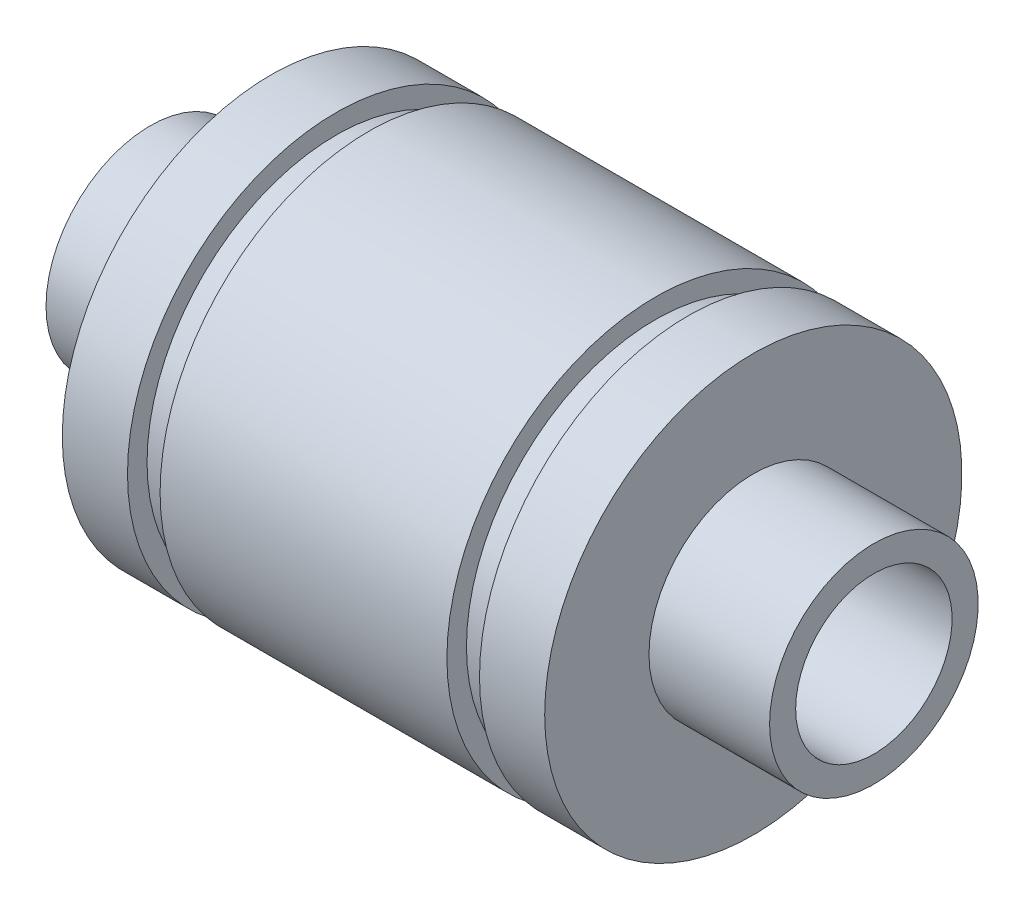
ISO-10303-21;
HEADER;
FILE_DESCRIPTION(('STEP AP214'),'2;1');
FILE_NAME('part.step','',(''),(''),'','','');
FILE_SCHEMA(('AUTOMOTIVE_DESIGN { 1 0 10303 214 1 1 1 1 }'));
ENDSEC;
DATA;
#1=APPLICATION_CONTEXT('core data for automotive mechanical design processes');
#2=APPLICATION_PROTOCOL_DEFINITION('international standard','automotive_design',2000,#1);
#3=PRODUCT_CONTEXT('',#1,'mechanical');
#4=PRODUCT('Part','Part','',(#3));
#5=PRODUCT_RELATED_PRODUCT_CATEGORY('part','',(#4));
#6=PRODUCT_DEFINITION_FORMATION('','',#4);
#7=PRODUCT_DEFINITION_CONTEXT('part definition',#1,'design');
#8=PRODUCT_DEFINITION('design','',#6,#7);
#9=PRODUCT_DEFINITION_SHAPE('','',#8);
#10=(LENGTH_UNIT() NAMED_UNIT(*) SI_UNIT(.MILLI.,.METRE.));
#11=(NAMED_UNIT(*) PLANE_ANGLE_UNIT() SI_UNIT($,.RADIAN.));
#12=(NAMED_UNIT(*) SI_UNIT($,.STERADIAN.) SOLID_ANGLE_UNIT());
#13=UNCERTAINTY_MEASURE_WITH_UNIT(LENGTH_MEASURE(1.E-05),#10,'distance_accuracy_value','');
#14=(GEOMETRIC_REPRESENTATION_CONTEXT(3) GLOBAL_UNCERTAINTY_ASSIGNED_CONTEXT((#13)) GLOBAL_UNIT_ASSIGNED_CONTEXT((#10,
#11,#12)) REPRESENTATION_CONTEXT('',''));
#15=CARTESIAN_POINT('',(0.,0.,0.));
#16=DIRECTION('',(0.,0.,1.));
#17=DIRECTION('',(1.,0.,0.));
#18=AXIS2_PLACEMENT_3D('',#15,#16,#17);
#19=CARTESIAN_POINT('',(27.75,8.,0.));
#20=DIRECTION('',(-1.,0.,0.));
#21=DIRECTION('',(0.,0.,1.));
#22=AXIS2_PLACEMENT_3D('',#19,#20,#21);
#23=PLANE('',#22);
#24=CARTESIAN_POINT('',(27.75,0.,0.));
#25=DIRECTION('',(-1.,0.,0.));
#26=DIRECTION('',(0.,0.,1.));
#27=AXIS2_PLACEMENT_3D('',#24,#25,#26);
#28=CIRCLE('',#27,6.);
#29=CARTESIAN_POINT('',(27.75,0.,6.));
#30=VERTEX_POINT('',#29);
#31=EDGE_CURVE('E80',#30,#30,#28,.T.);
#32=ORIENTED_EDGE('',*,*,#31,.T.);
#33=EDGE_LOOP('',(#32));
#34=FACE_BOUND('',#33,.T.);
#35=CARTESIAN_POINT('',(27.75,0.,0.));
#36=DIRECTION('',(-1.,0.,0.));
#37=DIRECTION('',(0.,0.,1.));
#38=AXIS2_PLACEMENT_3D('',#35,#36,#37);
#39=CIRCLE('',#38,8.);
#40=CARTESIAN_POINT('',(27.75,0.,8.));
#41=VERTEX_POINT('',#40);
#42=EDGE_CURVE('E77',#41,#41,#39,.T.);
#43=ORIENTED_EDGE('',*,*,#42,.F.);
#44=EDGE_LOOP('',(#43));
#45=FACE_BOUND('',#44,.T.);
#46=ADVANCED_FACE('F31',(#34,#45),#23,.F.);
#47=CARTESIAN_POINT('',(-27.75,7.99999999999999,0.));
#48=DIRECTION('',(1.,0.,0.));
#49=DIRECTION('',(0.,0.,-1.));
#50=AXIS2_PLACEMENT_3D('',#47,#48,#49);
#51=PLANE('',#50);
#52=CARTESIAN_POINT('',(-27.75,0.,0.));
#53=DIRECTION('',(-1.,0.,0.));
#54=DIRECTION('',(0.,0.,1.));
#55=AXIS2_PLACEMENT_3D('',#52,#53,#54);
#56=CIRCLE('',#55,6.);
#57=CARTESIAN_POINT('',(-27.75,0.,6.));
#58=VERTEX_POINT('',#57);
#59=EDGE_CURVE('E81',#58,#58,#56,.T.);
#60=ORIENTED_EDGE('',*,*,#59,.F.);
#61=EDGE_LOOP('',(#60));
#62=FACE_BOUND('',#61,.T.);
#63=CARTESIAN_POINT('',(-27.75,0.,0.));
#64=DIRECTION('',(-1.,0.,0.));
#65=DIRECTION('',(0.,0.,1.));
#66=AXIS2_PLACEMENT_3D('',#63,#64,#65);
#67=CIRCLE('',#66,7.99999999999999);
#68=CARTESIAN_POINT('',(-27.75,0.,7.99999999999999));
#69=VERTEX_POINT('',#68);
#70=EDGE_CURVE('E10',#69,#69,#67,.T.);
#71=ORIENTED_EDGE('',*,*,#70,.T.);
#72=EDGE_LOOP('',(#71));
#73=FACE_BOUND('',#72,.T.);
#74=ADVANCED_FACE('F96',(#62,#73),#51,.F.);
#75=CARTESIAN_POINT('',(-12.75,0.,0.));
#76=DIRECTION('',(-1.,0.,0.));
#77=DIRECTION('',(0.,0.,1.));
#78=AXIS2_PLACEMENT_3D('',#75,#76,#77);
#79=CYLINDRICAL_SURFACE('',#78,7.99999999999999);
#80=ORIENTED_EDGE('',*,*,#70,.F.);
#81=EDGE_LOOP('',(#80));
#82=FACE_BOUND('',#81,.T.);
#83=CARTESIAN_POINT('',(-18.5,0.,0.));
#84=DIRECTION('',(-1.,0.,0.));
#85=DIRECTION('',(0.,0.,1.));
#86=AXIS2_PLACEMENT_3D('',#83,#84,#85);
#87=CIRCLE('',#86,7.99999999999999);
#88=CARTESIAN_POINT('',(-18.5,0.,7.99999999999999));
#89=VERTEX_POINT('',#88);
#90=EDGE_CURVE('E37',#89,#89,#87,.T.);
#91=ORIENTED_EDGE('',*,*,#90,.T.);
#92=EDGE_LOOP('',(#91));
#93=FACE_BOUND('',#92,.T.);
#94=ADVANCED_FACE('F98',(#82,#93),#79,.T.);
#95=CARTESIAN_POINT('',(-18.5,16.,0.));
#96=DIRECTION('',(1.,0.,0.));
#97=DIRECTION('',(0.,0.,-1.));
#98=AXIS2_PLACEMENT_3D('',#95,#96,#97);
#99=PLANE('',#98);
#100=ORIENTED_EDGE('',*,*,#90,.F.);
#101=EDGE_LOOP('',(#100));
#102=FACE_BOUND('',#101,.T.);
#103=CARTESIAN_POINT('',(-18.5,0.,0.));
#104=DIRECTION('',(-1.,0.,0.));
#105=DIRECTION('',(0.,0.,1.));
#106=AXIS2_PLACEMENT_3D('',#103,#104,#105);
#107=CIRCLE('',#106,16.);
#108=CARTESIAN_POINT('',(-18.5,0.,16.));
#109=VERTEX_POINT('',#108);
#110=EDGE_CURVE('E41',#109,#109,#107,.T.);
#111=ORIENTED_EDGE('',*,*,#110,.T.);
#112=EDGE_LOOP('',(#111));
#113=FACE_BOUND('',#112,.T.);
#114=ADVANCED_FACE('F103',(#102,#113),#99,.F.);
#115=CARTESIAN_POINT('',(-12.75,0.,0.));
#116=DIRECTION('',(-1.,0.,0.));
#117=DIRECTION('',(0.,0.,1.));
#118=AXIS2_PLACEMENT_3D('',#115,#116,#117);
#119=CYLINDRICAL_SURFACE('',#118,16.);
#120=ORIENTED_EDGE('',*,*,#110,.F.);
#121=EDGE_LOOP('',(#120));
#122=FACE_BOUND('',#121,.T.);
#123=CARTESIAN_POINT('',(-13.5,0.,0.));
#124=DIRECTION('',(-1.,0.,0.));
#125=DIRECTION('',(0.,0.,1.));
#126=AXIS2_PLACEMENT_3D('',#123,#124,#125);
#127=CIRCLE('',#126,16.);
#128=CARTESIAN_POINT('',(-13.5,0.,16.));
#129=VERTEX_POINT('',#128);
#130=EDGE_CURVE('E45',#129,#129,#127,.T.);
#131=ORIENTED_EDGE('',*,*,#130,.T.);
#132=EDGE_LOOP('',(#131));
#133=FACE_BOUND('',#132,.T.);
#134=ADVANCED_FACE('F109',(#122,#133),#119,.T.);
#135=CARTESIAN_POINT('',(-13.5,16.,0.));
#136=DIRECTION('',(-1.,0.,0.));
#137=DIRECTION('',(0.,0.,1.));
#138=AXIS2_PLACEMENT_3D('',#135,#136,#137);
#139=PLANE('',#138);
#140=ORIENTED_EDGE('',*,*,#130,.F.);
#141=EDGE_LOOP('',(#140));
#142=FACE_BOUND('',#141,.T.);
#143=CARTESIAN_POINT('',(-13.5,0.,0.));
#144=DIRECTION('',(-1.,0.,0.));
#145=DIRECTION('',(0.,0.,1.));
#146=AXIS2_PLACEMENT_3D('',#143,#144,#145);
#147=CIRCLE('',#146,14.5);
#148=CARTESIAN_POINT('',(-13.5,0.,14.5));
#149=VERTEX_POINT('',#148);
#150=EDGE_CURVE('E50',#149,#149,#147,.T.);
#151=ORIENTED_EDGE('',*,*,#150,.T.);
#152=EDGE_LOOP('',(#151));
#153=FACE_BOUND('',#152,.T.);
#154=ADVANCED_FACE('F113',(#142,#153),#139,.F.);
#155=CARTESIAN_POINT('',(-12.75,0.,0.));
#156=DIRECTION('',(-1.,0.,0.));
#157=DIRECTION('',(0.,0.,1.));
#158=AXIS2_PLACEMENT_3D('',#155,#156,#157);
#159=CYLINDRICAL_SURFACE('',#158,14.5);
#160=ORIENTED_EDGE('',*,*,#150,.F.);
#161=EDGE_LOOP('',(#160));
#162=FACE_BOUND('',#161,.T.);
#163=CARTESIAN_POINT('',(-11.,0.,0.));
#164=DIRECTION('',(-1.,0.,0.));
#165=DIRECTION('',(0.,0.,1.));
#166=AXIS2_PLACEMENT_3D('',#163,#164,#165);
#167=CIRCLE('',#166,14.5);
#168=CARTESIAN_POINT('',(-11.,0.,14.5));
#169=VERTEX_POINT('',#168);
#170=EDGE_CURVE('E53',#169,#169,#167,.T.);
#171=ORIENTED_EDGE('',*,*,#170,.T.);
#172=EDGE_LOOP('',(#171));
#173=FACE_BOUND('',#172,.T.);
#174=ADVANCED_FACE('F117',(#162,#173),#159,.T.);
#175=CARTESIAN_POINT('',(-11.,14.5,0.));
#176=DIRECTION('',(1.,0.,0.));
#177=DIRECTION('',(0.,0.,-1.));
#178=AXIS2_PLACEMENT_3D('',#175,#176,#177);
#179=PLANE('',#178);
#180=ORIENTED_EDGE('',*,*,#170,.F.);
#181=EDGE_LOOP('',(#180));
#182=FACE_BOUND('',#181,.T.);
#183=CARTESIAN_POINT('',(-11.,0.,0.));
#184=DIRECTION('',(-1.,0.,0.));
#185=DIRECTION('',(0.,0.,1.));
#186=AXIS2_PLACEMENT_3D('',#183,#184,#185);
#187=CIRCLE('',#186,16.);
#188=CARTESIAN_POINT('',(-11.,0.,16.));
#189=VERTEX_POINT('',#188);
#190=EDGE_CURVE('E56',#189,#189,#187,.T.);
#191=ORIENTED_EDGE('',*,*,#190,.T.);
#192=EDGE_LOOP('',(#191));
#193=FACE_BOUND('',#192,.T.);
#194=ADVANCED_FACE('F121',(#182,#193),#179,.F.);
#195=CARTESIAN_POINT('',(-12.75,0.,0.));
#196=DIRECTION('',(-1.,0.,0.));
#197=DIRECTION('',(0.,0.,1.));
#198=AXIS2_PLACEMENT_3D('',#195,#196,#197);
#199=CYLINDRICAL_SURFACE('',#198,16.);
#200=ORIENTED_EDGE('',*,*,#190,.F.);
#201=EDGE_LOOP('',(#200));
#202=FACE_BOUND('',#201,.T.);
#203=CARTESIAN_POINT('',(11.,0.,0.));
#204=DIRECTION('',(-1.,0.,0.));
#205=DIRECTION('',(0.,0.,1.));
#206=AXIS2_PLACEMENT_3D('',#203,#204,#205);
#207=CIRCLE('',#206,16.);
#208=CARTESIAN_POINT('',(11.,0.,16.));
#209=VERTEX_POINT('',#208);
#210=EDGE_CURVE('E59',#209,#209,#207,.T.);
#211=ORIENTED_EDGE('',*,*,#210,.T.);
#212=EDGE_LOOP('',(#211));
#213=FACE_BOUND('',#212,.T.);
#214=ADVANCED_FACE('F125',(#202,#213),#199,.T.);
#215=CARTESIAN_POINT('',(11.,16.,0.));
#216=DIRECTION('',(-1.,0.,0.));
#217=DIRECTION('',(0.,0.,1.));
#218=AXIS2_PLACEMENT_3D('',#215,#216,#217);
#219=PLANE('',#218);
#220=ORIENTED_EDGE('',*,*,#210,.F.);
#221=EDGE_LOOP('',(#220));
#222=FACE_BOUND('',#221,.T.);
#223=CARTESIAN_POINT('',(11.,0.,0.));
#224=DIRECTION('',(-1.,0.,0.));
#225=DIRECTION('',(0.,0.,1.));
#226=AXIS2_PLACEMENT_3D('',#223,#224,#225);
#227=CIRCLE('',#226,14.5);
#228=CARTESIAN_POINT('',(11.,0.,14.5));
#229=VERTEX_POINT('',#228);
#230=EDGE_CURVE('E62',#229,#229,#227,.T.);
#231=ORIENTED_EDGE('',*,*,#230,.T.);
#232=EDGE_LOOP('',(#231));
#233=FACE_BOUND('',#232,.T.);
#234=ADVANCED_FACE('F129',(#222,#233),#219,.F.);
#235=CARTESIAN_POINT('',(-12.75,0.,0.));
#236=DIRECTION('',(-1.,0.,0.));
#237=DIRECTION('',(0.,0.,1.));
#238=AXIS2_PLACEMENT_3D('',#235,#236,#237);
#239=CYLINDRICAL_SURFACE('',#238,14.5);
#240=ORIENTED_EDGE('',*,*,#230,.F.);
#241=EDGE_LOOP('',(#240));
#242=FACE_BOUND('',#241,.T.);
#243=CARTESIAN_POINT('',(13.5,0.,0.));
#244=DIRECTION('',(-1.,0.,0.));
#245=DIRECTION('',(0.,0.,1.));
#246=AXIS2_PLACEMENT_3D('',#243,#244,#245);
#247=CIRCLE('',#246,14.5);
#248=CARTESIAN_POINT('',(13.5,0.,14.5));
#249=VERTEX_POINT('',#248);
#250=EDGE_CURVE('E65',#249,#249,#247,.T.);
#251=ORIENTED_EDGE('',*,*,#250,.T.);
#252=EDGE_LOOP('',(#251));
#253=FACE_BOUND('',#252,.T.);
#254=ADVANCED_FACE('F133',(#242,#253),#239,.T.);
#255=CARTESIAN_POINT('',(13.5,14.5,0.));
#256=DIRECTION('',(1.,0.,0.));
#257=DIRECTION('',(0.,0.,-1.));
#258=AXIS2_PLACEMENT_3D('',#255,#256,#257);
#259=PLANE('',#258);
#260=ORIENTED_EDGE('',*,*,#250,.F.);
#261=EDGE_LOOP('',(#260));
#262=FACE_BOUND('',#261,.T.);
#263=CARTESIAN_POINT('',(13.5,0.,0.));
#264=DIRECTION('',(-1.,0.,0.));
#265=DIRECTION('',(0.,0.,1.));
#266=AXIS2_PLACEMENT_3D('',#263,#264,#265);
#267=CIRCLE('',#266,16.);
#268=CARTESIAN_POINT('',(13.5,0.,16.));
#269=VERTEX_POINT('',#268);
#270=EDGE_CURVE('E68',#269,#269,#267,.T.);
#271=ORIENTED_EDGE('',*,*,#270,.T.);
#272=EDGE_LOOP('',(#271));
#273=FACE_BOUND('',#272,.T.);
#274=ADVANCED_FACE('F137',(#262,#273),#259,.F.);
#275=CARTESIAN_POINT('',(-12.75,0.,0.));
#276=DIRECTION('',(-1.,0.,0.));
#277=DIRECTION('',(0.,0.,1.));
#278=AXIS2_PLACEMENT_3D('',#275,#276,#277);
#279=CYLINDRICAL_SURFACE('',#278,16.);
#280=ORIENTED_EDGE('',*,*,#270,.F.);
#281=EDGE_LOOP('',(#280));
#282=FACE_BOUND('',#281,.T.);
#283=CARTESIAN_POINT('',(18.5,0.,0.));
#284=DIRECTION('',(-1.,0.,0.));
#285=DIRECTION('',(0.,0.,1.));
#286=AXIS2_PLACEMENT_3D('',#283,#284,#285);
#287=CIRCLE('',#286,16.);
#288=CARTESIAN_POINT('',(18.5,0.,16.));
#289=VERTEX_POINT('',#288);
#290=EDGE_CURVE('E71',#289,#289,#287,.T.);
#291=ORIENTED_EDGE('',*,*,#290,.T.);
#292=EDGE_LOOP('',(#291));
#293=FACE_BOUND('',#292,.T.);
#294=ADVANCED_FACE('F141',(#282,#293),#279,.T.);
#295=CARTESIAN_POINT('',(18.5,16.,0.));
#296=DIRECTION('',(-1.,0.,0.));
#297=DIRECTION('',(0.,0.,1.));
#298=AXIS2_PLACEMENT_3D('',#295,#296,#297);
#299=PLANE('',#298);
#300=ORIENTED_EDGE('',*,*,#290,.F.);
#301=EDGE_LOOP('',(#300));
#302=FACE_BOUND('',#301,.T.);
#303=CARTESIAN_POINT('',(18.5,0.,0.));
#304=DIRECTION('',(-1.,0.,0.));
#305=DIRECTION('',(0.,0.,1.));
#306=AXIS2_PLACEMENT_3D('',#303,#304,#305);
#307=CIRCLE('',#306,8.);
#308=CARTESIAN_POINT('',(18.5,0.,8.));
#309=VERTEX_POINT('',#308);
#310=EDGE_CURVE('E74',#309,#309,#307,.T.);
#311=ORIENTED_EDGE('',*,*,#310,.T.);
#312=EDGE_LOOP('',(#311));
#313=FACE_BOUND('',#312,.T.);
#314=ADVANCED_FACE('F145',(#302,#313),#299,.F.);
#315=CARTESIAN_POINT('',(-12.75,0.,0.));
#316=DIRECTION('',(-1.,0.,0.));
#317=DIRECTION('',(0.,0.,1.));
#318=AXIS2_PLACEMENT_3D('',#315,#316,#317);
#319=CYLINDRICAL_SURFACE('',#318,8.);
#320=ORIENTED_EDGE('',*,*,#310,.F.);
#321=EDGE_LOOP('',(#320));
#322=FACE_BOUND('',#321,.T.);
#323=ORIENTED_EDGE('',*,*,#42,.T.);
#324=EDGE_LOOP('',(#323));
#325=FACE_BOUND('',#324,.T.);
#326=ADVANCED_FACE('F92',(#322,#325),#319,.T.);
#327=CARTESIAN_POINT('',(27.75,0.,0.));
#328=DIRECTION('',(-1.,0.,0.));
#329=DIRECTION('',(0.,0.,1.));
#330=AXIS2_PLACEMENT_3D('',#327,#328,#329);
#331=CYLINDRICAL_SURFACE('',#330,6.);
#332=CARTESIAN_POINT('',(27.75,0.,6.));
#333=CARTESIAN_POINT('',(27.171875,0.,6.));
#334=CARTESIAN_POINT('',(26.59375,0.,6.));
#335=CARTESIAN_POINT('',(25.4375,0.,6.));
#336=CARTESIAN_POINT('',(24.859375,0.,6.));
#337=CARTESIAN_POINT('',(23.703125,0.,6.));
#338=CARTESIAN_POINT('',(23.125,0.,6.));
#339=CARTESIAN_POINT('',(21.96875,0.,6.));
#340=CARTESIAN_POINT('',(21.390625,0.,6.));
#341=CARTESIAN_POINT('',(20.234375,0.,6.));
#342=CARTESIAN_POINT('',(19.65625,0.,6.));
#343=CARTESIAN_POINT('',(18.5,0.,6.));
#344=CARTESIAN_POINT('',(17.921875,0.,6.));
#345=CARTESIAN_POINT('',(16.765625,0.,6.));
#346=CARTESIAN_POINT('',(16.1875,0.,6.));
#347=CARTESIAN_POINT('',(15.03125,0.,6.));
#348=CARTESIAN_POINT('',(14.453125,0.,6.));
#349=CARTESIAN_POINT('',(13.296875,0.,6.));
#350=CARTESIAN_POINT('',(12.71875,0.,6.));
#351=CARTESIAN_POINT('',(11.5625,0.,6.));
#352=CARTESIAN_POINT('',(10.984375,0.,6.));
#353=CARTESIAN_POINT('',(9.82812500000001,0.,6.));
#354=CARTESIAN_POINT('',(9.25000000000001,0.,6.));
#355=CARTESIAN_POINT('',(8.09375000000001,0.,6.));
#356=CARTESIAN_POINT('',(7.51562500000001,0.,6.));
#357=CARTESIAN_POINT('',(6.35937500000001,0.,6.));
#358=CARTESIAN_POINT('',(5.78125000000001,0.,6.));
#359=CARTESIAN_POINT('',(4.62500000000001,0.,6.));
#360=CARTESIAN_POINT('',(4.04687500000001,0.,6.));
#361=CARTESIAN_POINT('',(2.89062500000001,0.,6.));
#362=CARTESIAN_POINT('',(2.31250000000001,0.,6.));
#363=CARTESIAN_POINT('',(1.15625000000001,0.,6.));
#364=CARTESIAN_POINT('',(0.578125000000007,0.,6.));
#365=CARTESIAN_POINT('',(-0.578124999999993,0.,6.));
#366=CARTESIAN_POINT('',(-1.15624999999999,0.,6.));
#367=CARTESIAN_POINT('',(-2.31249999999999,0.,6.));
#368=CARTESIAN_POINT('',(-2.89062499999999,0.,6.));
#369=CARTESIAN_POINT('',(-4.04687499999999,0.,6.));
#370=CARTESIAN_POINT('',(-4.62499999999999,0.,6.));
#371=CARTESIAN_POINT('',(-5.78124999999999,0.,6.));
#372=CARTESIAN_POINT('',(-6.35937499999999,0.,6.));
#373=CARTESIAN_POINT('',(-7.51562499999999,0.,6.));
#374=CARTESIAN_POINT('',(-8.09374999999999,0.,6.));
#375=CARTESIAN_POINT('',(-9.24999999999999,0.,6.));
#376=CARTESIAN_POINT('',(-9.82812499999999,0.,6.));
#377=CARTESIAN_POINT('',(-10.984375,0.,6.));
#378=CARTESIAN_POINT('',(-11.5625,0.,6.));
#379=CARTESIAN_POINT('',(-12.71875,0.,6.));
#380=CARTESIAN_POINT('',(-13.296875,0.,6.));
#381=CARTESIAN_POINT('',(-14.453125,0.,6.));
#382=CARTESIAN_POINT('',(-15.03125,0.,6.));
#383=CARTESIAN_POINT('',(-16.1875,0.,6.));
#384=CARTESIAN_POINT('',(-16.765625,0.,6.));
#385=CARTESIAN_POINT('',(-17.921875,0.,6.));
#386=CARTESIAN_POINT('',(-18.5,0.,6.));
#387=CARTESIAN_POINT('',(-19.65625,0.,6.));
#388=CARTESIAN_POINT('',(-20.234375,0.,6.));
#389=CARTESIAN_POINT('',(-21.390625,0.,6.));
#390=CARTESIAN_POINT('',(-21.96875,0.,6.));
#391=CARTESIAN_POINT('',(-23.125,0.,6.));
#392=CARTESIAN_POINT('',(-23.703125,0.,6.));
#393=CARTESIAN_POINT('',(-24.859375,0.,6.));
#394=CARTESIAN_POINT('',(-25.4375,0.,6.));
#395=CARTESIAN_POINT('',(-26.59375,0.,6.));
#396=CARTESIAN_POINT('',(-27.171875,0.,6.));
#397=CARTESIAN_POINT('',(-27.75,0.,6.));
#398=B_SPLINE_CURVE_WITH_KNOTS('',3,(#332,#333,#334,#335,#336,#337,#338,#339,#340,#341,#342,
#343,#344,#345,#346,#347,#348,#349,#350,#351,#352,#353,#354,#355,#356,#357,#358,#359,#360,#361,
#362,#363,#364,#365,#366,#367,#368,#369,#370,#371,#372,#373,#374,#375,#376,#377,#378,#379,#380,
#381,#382,#383,#384,#385,#386,#387,#388,#389,#390,#391,#392,#393,#394,#395,#396,#397),
.UNSPECIFIED.,.F.,.F.,(4,2,2,2,2,2,2,2,2,2,2,2,2,2,2,2,2,2,2,2,2,2,2,2,2,2,2,2,2,2,2,2,4),(0.,
1.734375,3.46875,5.203125,6.9375,8.671875,10.40625,12.140625,13.875,15.609375,17.34375,
19.078125,20.8125,22.546875,24.28125,26.015625,27.75,29.484375,31.21875,32.953125,34.6875,
36.421875,38.15625,39.890625,41.625,43.359375,45.09375,46.828125,48.5625,50.296875,52.03125,
53.765625,55.5),.UNSPECIFIED.);
#399=EDGE_CURVE('BSEAM89',#30,#58,#398,.T.);
#400=ORIENTED_EDGE('',*,*,#31,.F.);
#401=ORIENTED_EDGE('',*,*,#59,.T.);
#402=ORIENTED_EDGE('',*,*,#399,.T.);
#403=ORIENTED_EDGE('',*,*,#399,.F.);
#404=EDGE_LOOP('',(#400,#402,#401,#403));
#405=FACE_BOUND('',#404,.T.);
#406=ADVANCED_FACE('F89',(#405),#331,.F.);
#407=CLOSED_SHELL('',(#46,#74,#94,#114,#134,#154,#174,#194,#214,#234,#254,#274,#294,#314,#326,#406));
#408=MANIFOLD_SOLID_BREP('B2',#407);
#409=ADVANCED_BREP_SHAPE_REPRESENTATION('',(#18,#408),#14);
#410=SHAPE_DEFINITION_REPRESENTATION(#9,#409);
ENDSEC;
END-ISO-10303-21;
